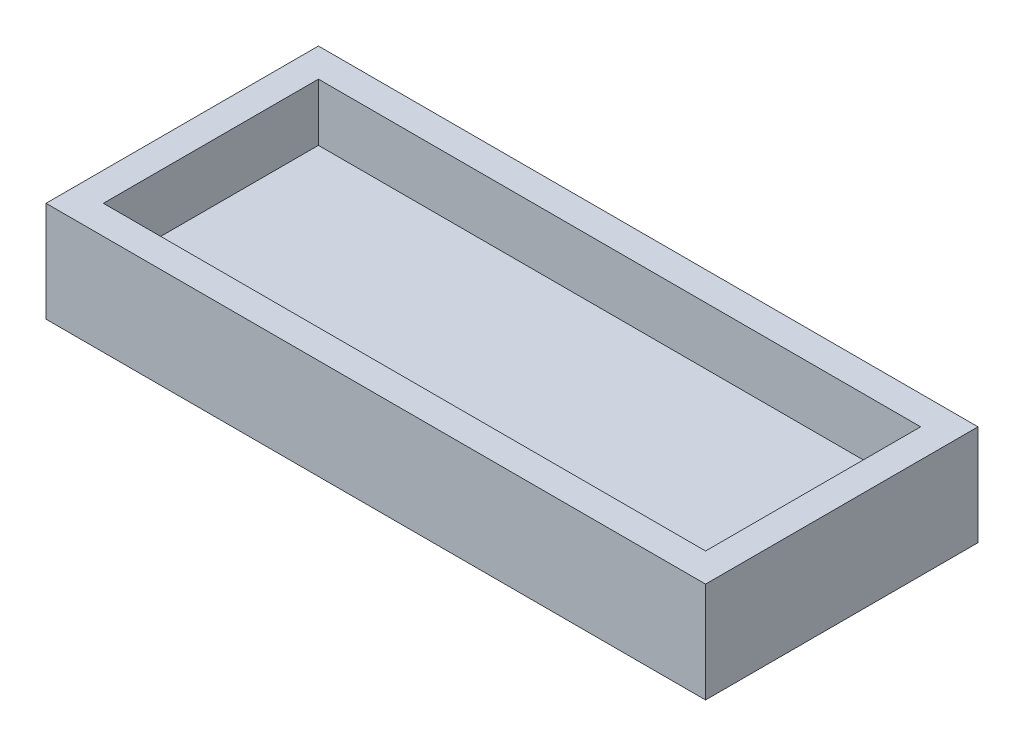
ISO-10303-21;
HEADER;
FILE_DESCRIPTION(('STEP AP214'),'2;1');
FILE_NAME('part.step','',(''),(''),'','','');
FILE_SCHEMA(('AUTOMOTIVE_DESIGN { 1 0 10303 214 1 1 1 1 }'));
ENDSEC;
DATA;
#1=APPLICATION_CONTEXT('core data for automotive mechanical design processes');
#2=APPLICATION_PROTOCOL_DEFINITION('international standard','automotive_design',2000,#1);
#3=PRODUCT_CONTEXT('',#1,'mechanical');
#4=PRODUCT('Part','Part','',(#3));
#5=PRODUCT_RELATED_PRODUCT_CATEGORY('part','',(#4));
#6=PRODUCT_DEFINITION_FORMATION('','',#4);
#7=PRODUCT_DEFINITION_CONTEXT('part definition',#1,'design');
#8=PRODUCT_DEFINITION('design','',#6,#7);
#9=PRODUCT_DEFINITION_SHAPE('','',#8);
#10=(LENGTH_UNIT() NAMED_UNIT(*) SI_UNIT(.MILLI.,.METRE.));
#11=(NAMED_UNIT(*) PLANE_ANGLE_UNIT() SI_UNIT($,.RADIAN.));
#12=(NAMED_UNIT(*) SI_UNIT($,.STERADIAN.) SOLID_ANGLE_UNIT());
#13=UNCERTAINTY_MEASURE_WITH_UNIT(LENGTH_MEASURE(1.E-05),#10,'distance_accuracy_value','');
#14=(GEOMETRIC_REPRESENTATION_CONTEXT(3) GLOBAL_UNCERTAINTY_ASSIGNED_CONTEXT((#13)) GLOBAL_UNIT_ASSIGNED_CONTEXT((#10,
#11,#12)) REPRESENTATION_CONTEXT('',''));
#15=CARTESIAN_POINT('',(0.,0.,0.));
#16=DIRECTION('',(0.,0.,1.));
#17=DIRECTION('',(1.,0.,0.));
#18=AXIS2_PLACEMENT_3D('',#15,#16,#17);
#19=CARTESIAN_POINT('',(0.,3.,0.));
#20=DIRECTION('',(0.,1.,0.));
#21=DIRECTION('',(0.,0.,1.));
#22=AXIS2_PLACEMENT_3D('',#19,#20,#21);
#23=PLANE('',#22);
#24=DIRECTION('',(0.,0.,-1.));
#25=VECTOR('',#24,1.);
#26=CARTESIAN_POINT('',(21.,3.,-7.5));
#27=LINE('',#26,#25);
#28=CARTESIAN_POINT('',(21.,3.,7.5));
#29=VERTEX_POINT('',#28);
#30=CARTESIAN_POINT('',(21.,3.,-7.5));
#31=VERTEX_POINT('',#30);
#32=EDGE_CURVE('E103',#29,#31,#27,.T.);
#33=ORIENTED_EDGE('',*,*,#32,.T.);
#34=DIRECTION('',(-1.,0.,0.));
#35=VECTOR('',#34,1.);
#36=CARTESIAN_POINT('',(-21.,3.,-7.5));
#37=LINE('',#36,#35);
#38=CARTESIAN_POINT('',(-21.,3.,-7.5));
#39=VERTEX_POINT('',#38);
#40=EDGE_CURVE('E56',#31,#39,#37,.T.);
#41=ORIENTED_EDGE('',*,*,#40,.T.);
#42=DIRECTION('',(0.,0.,1.));
#43=VECTOR('',#42,1.);
#44=CARTESIAN_POINT('',(-21.,3.,-7.5));
#45=LINE('',#44,#43);
#46=CARTESIAN_POINT('',(-21.,3.,7.5));
#47=VERTEX_POINT('',#46);
#48=EDGE_CURVE('E41',#39,#47,#45,.T.);
#49=ORIENTED_EDGE('',*,*,#48,.T.);
#50=DIRECTION('',(1.,0.,0.));
#51=VECTOR('',#50,1.);
#52=CARTESIAN_POINT('',(-21.,3.,7.5));
#53=LINE('',#52,#51);
#54=EDGE_CURVE('E11',#47,#29,#53,.T.);
#55=ORIENTED_EDGE('',*,*,#54,.T.);
#56=EDGE_LOOP('',(#33,#41,#49,#55));
#57=FACE_BOUND('',#56,.T.);
#58=ADVANCED_FACE('F33',(#57),#23,.T.);
#59=CARTESIAN_POINT('',(23.,7.,9.5));
#60=DIRECTION('',(0.,0.,1.));
#61=DIRECTION('',(1.,0.,0.));
#62=AXIS2_PLACEMENT_3D('',#59,#60,#61);
#63=PLANE('',#62);
#64=DIRECTION('',(-1.,0.,0.));
#65=VECTOR('',#64,1.);
#66=CARTESIAN_POINT('',(23.,0.,9.5));
#67=LINE('',#66,#65);
#68=CARTESIAN_POINT('',(23.,0.,9.5));
#69=VERTEX_POINT('',#68);
#70=CARTESIAN_POINT('',(-23.,0.,9.5));
#71=VERTEX_POINT('',#70);
#72=EDGE_CURVE('E125',#69,#71,#67,.T.);
#73=ORIENTED_EDGE('',*,*,#72,.F.);
#74=DIRECTION('',(0.,-1.,0.));
#75=VECTOR('',#74,1.);
#76=CARTESIAN_POINT('',(23.,7.,9.5));
#77=LINE('',#76,#75);
#78=CARTESIAN_POINT('',(23.,7.,9.5));
#79=VERTEX_POINT('',#78);
#80=EDGE_CURVE('E153',#79,#69,#77,.T.);
#81=ORIENTED_EDGE('',*,*,#80,.F.);
#82=DIRECTION('',(-1.,0.,0.));
#83=VECTOR('',#82,1.);
#84=CARTESIAN_POINT('',(23.,7.,9.5));
#85=LINE('',#84,#83);
#86=CARTESIAN_POINT('',(-23.,7.,9.5));
#87=VERTEX_POINT('',#86);
#88=EDGE_CURVE('E129',#79,#87,#85,.T.);
#89=ORIENTED_EDGE('',*,*,#88,.T.);
#90=DIRECTION('',(0.,-1.,0.));
#91=VECTOR('',#90,1.);
#92=CARTESIAN_POINT('',(-23.,7.,9.5));
#93=LINE('',#92,#91);
#94=EDGE_CURVE('E142',#87,#71,#93,.T.);
#95=ORIENTED_EDGE('',*,*,#94,.T.);
#96=EDGE_LOOP('',(#73,#81,#89,#95));
#97=FACE_BOUND('',#96,.T.);
#98=ADVANCED_FACE('F175',(#97),#63,.T.);
#99=CARTESIAN_POINT('',(23.,7.,9.5));
#100=DIRECTION('',(1.,0.,0.));
#101=DIRECTION('',(0.,0.,-1.));
#102=AXIS2_PLACEMENT_3D('',#99,#100,#101);
#103=PLANE('',#102);
#104=DIRECTION('',(0.,0.,1.));
#105=VECTOR('',#104,1.);
#106=CARTESIAN_POINT('',(23.,0.,9.5));
#107=LINE('',#106,#105);
#108=CARTESIAN_POINT('',(23.,0.,-9.5));
#109=VERTEX_POINT('',#108);
#110=EDGE_CURVE('E133',#109,#69,#107,.T.);
#111=ORIENTED_EDGE('',*,*,#110,.F.);
#112=DIRECTION('',(0.,-1.,0.));
#113=VECTOR('',#112,1.);
#114=CARTESIAN_POINT('',(23.,7.,-9.5));
#115=LINE('',#114,#113);
#116=CARTESIAN_POINT('',(23.,7.,-9.5));
#117=VERTEX_POINT('',#116);
#118=EDGE_CURVE('E155',#117,#109,#115,.T.);
#119=ORIENTED_EDGE('',*,*,#118,.F.);
#120=DIRECTION('',(0.,0.,1.));
#121=VECTOR('',#120,1.);
#122=CARTESIAN_POINT('',(23.,7.,9.5));
#123=LINE('',#122,#121);
#124=EDGE_CURVE('E139',#117,#79,#123,.T.);
#125=ORIENTED_EDGE('',*,*,#124,.T.);
#126=ORIENTED_EDGE('',*,*,#80,.T.);
#127=EDGE_LOOP('',(#111,#119,#125,#126));
#128=FACE_BOUND('',#127,.T.);
#129=ADVANCED_FACE('F179',(#128),#103,.T.);
#130=CARTESIAN_POINT('',(23.,7.,-9.5));
#131=DIRECTION('',(0.,0.,-1.));
#132=DIRECTION('',(-1.,0.,0.));
#133=AXIS2_PLACEMENT_3D('',#130,#131,#132);
#134=PLANE('',#133);
#135=DIRECTION('',(1.,0.,0.));
#136=VECTOR('',#135,1.);
#137=CARTESIAN_POINT('',(23.,0.,-9.5));
#138=LINE('',#137,#136);
#139=CARTESIAN_POINT('',(-23.,0.,-9.5));
#140=VERTEX_POINT('',#139);
#141=EDGE_CURVE('E148',#140,#109,#138,.T.);
#142=ORIENTED_EDGE('',*,*,#141,.F.);
#143=DIRECTION('',(0.,-1.,0.));
#144=VECTOR('',#143,1.);
#145=CARTESIAN_POINT('',(-23.,7.,-9.5));
#146=LINE('',#145,#144);
#147=CARTESIAN_POINT('',(-23.,7.,-9.5));
#148=VERTEX_POINT('',#147);
#149=EDGE_CURVE('E157',#148,#140,#146,.T.);
#150=ORIENTED_EDGE('',*,*,#149,.F.);
#151=DIRECTION('',(1.,0.,0.));
#152=VECTOR('',#151,1.);
#153=CARTESIAN_POINT('',(23.,7.,-9.5));
#154=LINE('',#153,#152);
#155=EDGE_CURVE('E136',#148,#117,#154,.T.);
#156=ORIENTED_EDGE('',*,*,#155,.T.);
#157=ORIENTED_EDGE('',*,*,#118,.T.);
#158=EDGE_LOOP('',(#142,#150,#156,#157));
#159=FACE_BOUND('',#158,.T.);
#160=ADVANCED_FACE('F186',(#159),#134,.T.);
#161=CARTESIAN_POINT('',(-23.,7.,9.5));
#162=DIRECTION('',(-1.,0.,0.));
#163=DIRECTION('',(0.,0.,1.));
#164=AXIS2_PLACEMENT_3D('',#161,#162,#163);
#165=PLANE('',#164);
#166=DIRECTION('',(0.,0.,-1.));
#167=VECTOR('',#166,1.);
#168=CARTESIAN_POINT('',(-23.,0.,9.5));
#169=LINE('',#168,#167);
#170=EDGE_CURVE('E145',#71,#140,#169,.T.);
#171=ORIENTED_EDGE('',*,*,#170,.F.);
#172=ORIENTED_EDGE('',*,*,#94,.F.);
#173=DIRECTION('',(0.,0.,-1.));
#174=VECTOR('',#173,1.);
#175=CARTESIAN_POINT('',(-23.,7.,9.5));
#176=LINE('',#175,#174);
#177=EDGE_CURVE('E132',#87,#148,#176,.T.);
#178=ORIENTED_EDGE('',*,*,#177,.T.);
#179=ORIENTED_EDGE('',*,*,#149,.T.);
#180=EDGE_LOOP('',(#171,#172,#178,#179));
#181=FACE_BOUND('',#180,.T.);
#182=ADVANCED_FACE('F183',(#181),#165,.T.);
#183=CARTESIAN_POINT('',(0.,7.,0.));
#184=DIRECTION('',(0.,-1.,0.));
#185=DIRECTION('',(0.,0.,-1.));
#186=AXIS2_PLACEMENT_3D('',#183,#184,#185);
#187=PLANE('',#186);
#188=DIRECTION('',(1.,0.,0.));
#189=VECTOR('',#188,1.);
#190=CARTESIAN_POINT('',(21.,7.,-7.5));
#191=LINE('',#190,#189);
#192=CARTESIAN_POINT('',(-21.,7.,-7.5));
#193=VERTEX_POINT('',#192);
#194=CARTESIAN_POINT('',(21.,7.,-7.5));
#195=VERTEX_POINT('',#194);
#196=EDGE_CURVE('E105',#193,#195,#191,.T.);
#197=ORIENTED_EDGE('',*,*,#196,.T.);
#198=DIRECTION('',(0.,0.,1.));
#199=VECTOR('',#198,1.);
#200=CARTESIAN_POINT('',(21.,7.,7.5));
#201=LINE('',#200,#199);
#202=CARTESIAN_POINT('',(21.,7.,7.5));
#203=VERTEX_POINT('',#202);
#204=EDGE_CURVE('E100',#195,#203,#201,.T.);
#205=ORIENTED_EDGE('',*,*,#204,.T.);
#206=DIRECTION('',(-1.,0.,0.));
#207=VECTOR('',#206,1.);
#208=CARTESIAN_POINT('',(21.,7.,7.5));
#209=LINE('',#208,#207);
#210=CARTESIAN_POINT('',(-21.,7.,7.5));
#211=VERTEX_POINT('',#210);
#212=EDGE_CURVE('E109',#203,#211,#209,.T.);
#213=ORIENTED_EDGE('',*,*,#212,.T.);
#214=DIRECTION('',(0.,0.,-1.));
#215=VECTOR('',#214,1.);
#216=CARTESIAN_POINT('',(-21.,7.,7.5));
#217=LINE('',#216,#215);
#218=EDGE_CURVE('E114',#211,#193,#217,.T.);
#219=ORIENTED_EDGE('',*,*,#218,.T.);
#220=EDGE_LOOP('',(#197,#205,#213,#219));
#221=FACE_BOUND('',#220,.T.);
#222=ORIENTED_EDGE('',*,*,#88,.F.);
#223=ORIENTED_EDGE('',*,*,#124,.F.);
#224=ORIENTED_EDGE('',*,*,#155,.F.);
#225=ORIENTED_EDGE('',*,*,#177,.F.);
#226=EDGE_LOOP('',(#222,#223,#224,#225));
#227=FACE_BOUND('',#226,.T.);
#228=ADVANCED_FACE('F116',(#221,#227),#187,.F.);
#229=CARTESIAN_POINT('',(21.,7.,7.5));
#230=DIRECTION('',(1.,0.,0.));
#231=DIRECTION('',(0.,0.,-1.));
#232=AXIS2_PLACEMENT_3D('',#229,#230,#231);
#233=PLANE('',#232);
#234=ORIENTED_EDGE('',*,*,#32,.F.);
#235=DIRECTION('',(0.,-1.,0.));
#236=VECTOR('',#235,1.);
#237=CARTESIAN_POINT('',(21.,7.,7.5));
#238=LINE('',#237,#236);
#239=EDGE_CURVE('E48',#203,#29,#238,.T.);
#240=ORIENTED_EDGE('',*,*,#239,.F.);
#241=ORIENTED_EDGE('',*,*,#204,.F.);
#242=DIRECTION('',(0.,-1.,0.));
#243=VECTOR('',#242,1.);
#244=CARTESIAN_POINT('',(21.,7.,-7.5));
#245=LINE('',#244,#243);
#246=EDGE_CURVE('E123',#195,#31,#245,.T.);
#247=ORIENTED_EDGE('',*,*,#246,.T.);
#248=EDGE_LOOP('',(#234,#240,#241,#247));
#249=FACE_BOUND('',#248,.T.);
#250=ADVANCED_FACE('F98',(#249),#233,.F.);
#251=CARTESIAN_POINT('',(21.,7.,-7.5));
#252=DIRECTION('',(0.,0.,-1.));
#253=DIRECTION('',(-1.,0.,0.));
#254=AXIS2_PLACEMENT_3D('',#251,#252,#253);
#255=PLANE('',#254);
#256=ORIENTED_EDGE('',*,*,#40,.F.);
#257=ORIENTED_EDGE('',*,*,#246,.F.);
#258=ORIENTED_EDGE('',*,*,#196,.F.);
#259=DIRECTION('',(0.,-1.,0.));
#260=VECTOR('',#259,1.);
#261=CARTESIAN_POINT('',(-21.,7.,-7.5));
#262=LINE('',#261,#260);
#263=EDGE_CURVE('E126',#193,#39,#262,.T.);
#264=ORIENTED_EDGE('',*,*,#263,.T.);
#265=EDGE_LOOP('',(#256,#257,#258,#264));
#266=FACE_BOUND('',#265,.T.);
#267=ADVANCED_FACE('F165',(#266),#255,.F.);
#268=CARTESIAN_POINT('',(-21.,7.,7.5));
#269=DIRECTION('',(-1.,0.,0.));
#270=DIRECTION('',(0.,0.,1.));
#271=AXIS2_PLACEMENT_3D('',#268,#269,#270);
#272=PLANE('',#271);
#273=ORIENTED_EDGE('',*,*,#48,.F.);
#274=ORIENTED_EDGE('',*,*,#263,.F.);
#275=ORIENTED_EDGE('',*,*,#218,.F.);
#276=DIRECTION('',(0.,-1.,0.));
#277=VECTOR('',#276,1.);
#278=CARTESIAN_POINT('',(-21.,7.,7.5));
#279=LINE('',#278,#277);
#280=EDGE_CURVE('E104',#211,#47,#279,.T.);
#281=ORIENTED_EDGE('',*,*,#280,.T.);
#282=EDGE_LOOP('',(#273,#274,#275,#281));
#283=FACE_BOUND('',#282,.T.);
#284=ADVANCED_FACE('F164',(#283),#272,.F.);
#285=CARTESIAN_POINT('',(21.,7.,7.5));
#286=DIRECTION('',(0.,0.,1.));
#287=DIRECTION('',(1.,0.,0.));
#288=AXIS2_PLACEMENT_3D('',#285,#286,#287);
#289=PLANE('',#288);
#290=ORIENTED_EDGE('',*,*,#54,.F.);
#291=ORIENTED_EDGE('',*,*,#280,.F.);
#292=ORIENTED_EDGE('',*,*,#212,.F.);
#293=ORIENTED_EDGE('',*,*,#239,.T.);
#294=EDGE_LOOP('',(#290,#291,#292,#293));
#295=FACE_BOUND('',#294,.T.);
#296=ADVANCED_FACE('F110',(#295),#289,.F.);
#297=CARTESIAN_POINT('',(0.,0.,0.));
#298=DIRECTION('',(0.,1.,0.));
#299=DIRECTION('',(0.,0.,1.));
#300=AXIS2_PLACEMENT_3D('',#297,#298,#299);
#301=PLANE('',#300);
#302=ORIENTED_EDGE('',*,*,#72,.T.);
#303=ORIENTED_EDGE('',*,*,#170,.T.);
#304=ORIENTED_EDGE('',*,*,#141,.T.);
#305=ORIENTED_EDGE('',*,*,#110,.T.);
#306=EDGE_LOOP('',(#302,#303,#304,#305));
#307=FACE_BOUND('',#306,.T.);
#308=ADVANCED_FACE('F35',(#307),#301,.F.);
#309=CLOSED_SHELL('',(#58,#98,#129,#160,#182,#228,#250,#267,#284,#296,#308));
#310=MANIFOLD_SOLID_BREP('B2',#309);
#311=ADVANCED_BREP_SHAPE_REPRESENTATION('',(#18,#310),#14);
#312=SHAPE_DEFINITION_REPRESENTATION(#9,#311);
ENDSEC;
END-ISO-10303-21;
